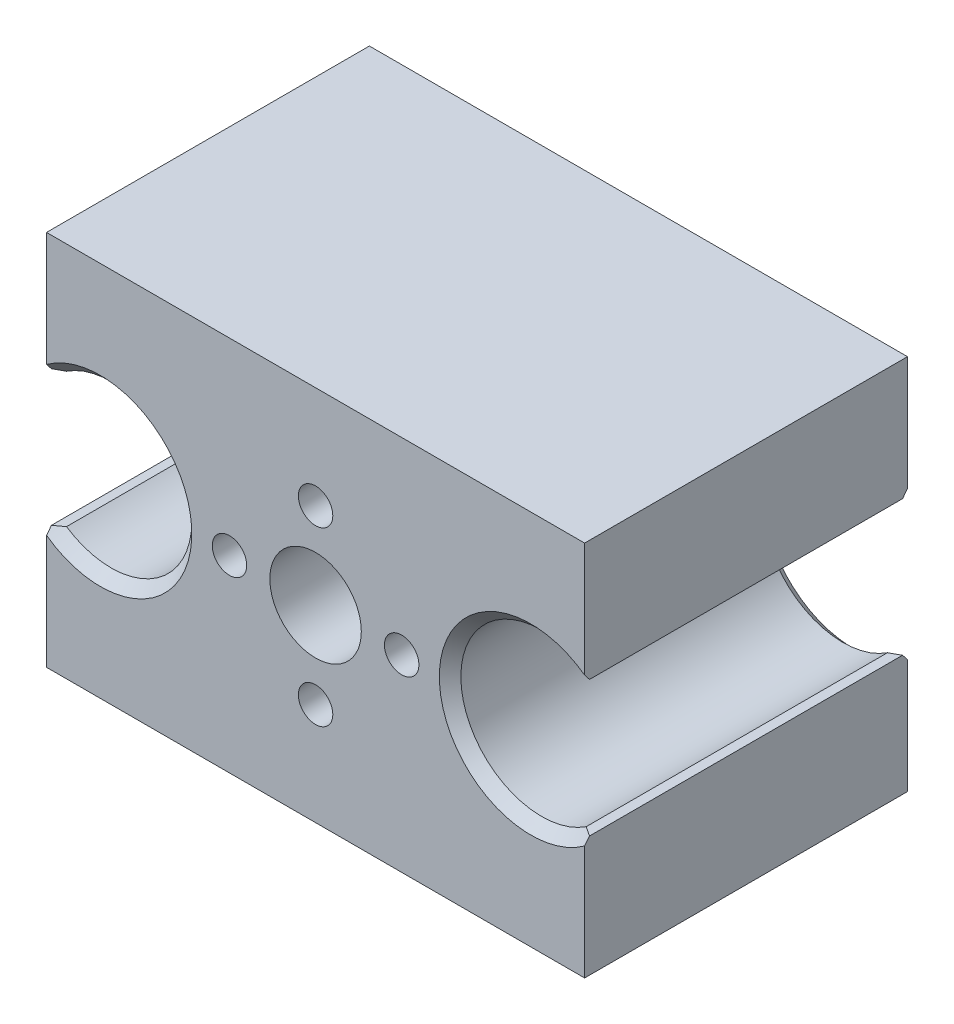
ISO-10303-21;
HEADER;
FILE_DESCRIPTION(('STEP AP214'),'2;1');
FILE_NAME('part.step','',(''),(''),'','','');
FILE_SCHEMA(('AUTOMOTIVE_DESIGN { 1 0 10303 214 1 1 1 1 }'));
ENDSEC;
DATA;
#1=APPLICATION_CONTEXT('core data for automotive mechanical design processes');
#2=APPLICATION_PROTOCOL_DEFINITION('international standard','automotive_design',2000,#1);
#3=PRODUCT_CONTEXT('',#1,'mechanical');
#4=PRODUCT('Part','Part','',(#3));
#5=PRODUCT_RELATED_PRODUCT_CATEGORY('part','',(#4));
#6=PRODUCT_DEFINITION_FORMATION('','',#4);
#7=PRODUCT_DEFINITION_CONTEXT('part definition',#1,'design');
#8=PRODUCT_DEFINITION('design','',#6,#7);
#9=PRODUCT_DEFINITION_SHAPE('','',#8);
#10=(LENGTH_UNIT() NAMED_UNIT(*) SI_UNIT(.MILLI.,.METRE.));
#11=(NAMED_UNIT(*) PLANE_ANGLE_UNIT() SI_UNIT($,.RADIAN.));
#12=(NAMED_UNIT(*) SI_UNIT($,.STERADIAN.) SOLID_ANGLE_UNIT());
#13=UNCERTAINTY_MEASURE_WITH_UNIT(LENGTH_MEASURE(1.E-05),#10,'distance_accuracy_value','');
#14=(GEOMETRIC_REPRESENTATION_CONTEXT(3) GLOBAL_UNCERTAINTY_ASSIGNED_CONTEXT((#13)) GLOBAL_UNIT_ASSIGNED_CONTEXT((#10,
#11,#12)) REPRESENTATION_CONTEXT('',''));
#15=CARTESIAN_POINT('',(0.,0.,0.));
#16=DIRECTION('',(0.,0.,1.));
#17=DIRECTION('',(1.,0.,0.));
#18=AXIS2_PLACEMENT_3D('',#15,#16,#17);
#19=CARTESIAN_POINT('',(25.,-17.5,30.));
#20=DIRECTION('',(-1.,0.,0.));
#21=DIRECTION('',(0.,0.,1.));
#22=AXIS2_PLACEMENT_3D('',#19,#20,#21);
#23=PLANE('',#22);
#24=DIRECTION('',(0.,0.,1.));
#25=VECTOR('',#24,1.);
#26=CARTESIAN_POINT('',(25.,-6.29837387624891,30.));
#27=LINE('',#26,#25);
#28=CARTESIAN_POINT('',(25.,-6.29837387624891,0.458264274112555));
#29=VERTEX_POINT('',#28);
#30=CARTESIAN_POINT('',(25.,-6.29837387624891,29.5417357258874));
#31=VERTEX_POINT('',#30);
#32=EDGE_CURVE('E185',#29,#31,#27,.T.);
#33=ORIENTED_EDGE('',*,*,#32,.T.);
#34=CARTESIAN_POINT('',(25.,-6.29837387624891,29.5417357258874));
#35=CARTESIAN_POINT('',(25.,-6.39488385614054,29.6173659402342));
#36=CARTESIAN_POINT('',(25.,-6.49109633830478,29.6933697531287));
#37=CARTESIAN_POINT('',(25.,-6.6829262265328,29.8461245117944));
#38=CARTESIAN_POINT('',(25.,-6.77854363309685,29.9228754569375));
#39=CARTESIAN_POINT('',(25.,-6.8738635424338,30.));
#40=B_SPLINE_CURVE_WITH_KNOTS('',3,(#34,#35,#36,#37,#38,#39),.UNSPECIFIED.,.F.,.F.,(4,2,4),(0.,
0.367832559309629,0.735664809344251),.UNSPECIFIED.);
#41=CARTESIAN_POINT('',(25.,-6.8738635424338,30.));
#42=VERTEX_POINT('',#41);
#43=EDGE_CURVE('E216',#31,#42,#40,.T.);
#44=ORIENTED_EDGE('',*,*,#43,.T.);
#45=DIRECTION('',(0.,1.,0.));
#46=VECTOR('',#45,1.);
#47=CARTESIAN_POINT('',(25.,-17.5,30.));
#48=LINE('',#47,#46);
#49=CARTESIAN_POINT('',(25.,-17.5,30.));
#50=VERTEX_POINT('',#49);
#51=EDGE_CURVE('E167',#50,#42,#48,.T.);
#52=ORIENTED_EDGE('',*,*,#51,.F.);
#53=DIRECTION('',(0.,0.,-1.));
#54=VECTOR('',#53,1.);
#55=CARTESIAN_POINT('',(25.,-17.5,30.));
#56=LINE('',#55,#54);
#57=CARTESIAN_POINT('',(25.,-17.5,0.));
#58=VERTEX_POINT('',#57);
#59=EDGE_CURVE('E421',#50,#58,#56,.T.);
#60=ORIENTED_EDGE('',*,*,#59,.T.);
#61=DIRECTION('',(0.,1.,0.));
#62=VECTOR('',#61,1.);
#63=CARTESIAN_POINT('',(25.,-17.5,0.));
#64=LINE('',#63,#62);
#65=CARTESIAN_POINT('',(25.,-6.87386354243378,0.));
#66=VERTEX_POINT('',#65);
#67=EDGE_CURVE('E424',#58,#66,#64,.T.);
#68=ORIENTED_EDGE('',*,*,#67,.T.);
#69=CARTESIAN_POINT('',(25.,-6.87386354243378,0.));
#70=CARTESIAN_POINT('',(25.,-6.77854363309684,0.0771245430624894));
#71=CARTESIAN_POINT('',(25.,-6.68292622653279,0.153875488205571));
#72=CARTESIAN_POINT('',(25.,-6.49109633830477,0.306630246871336));
#73=CARTESIAN_POINT('',(25.,-6.39488385614054,0.382634059765773));
#74=CARTESIAN_POINT('',(25.,-6.29837387624891,0.458264274112556));
#75=B_SPLINE_CURVE_WITH_KNOTS('',3,(#69,#70,#71,#72,#73,#74),.UNSPECIFIED.,.F.,.F.,(4,2,4),(0.,
0.367832250034613,0.735664809344231),.UNSPECIFIED.);
#76=EDGE_CURVE('E183',#66,#29,#75,.T.);
#77=ORIENTED_EDGE('',*,*,#76,.T.);
#78=EDGE_LOOP('',(#33,#44,#52,#60,#68,#77));
#79=FACE_BOUND('',#78,.T.);
#80=ADVANCED_FACE('F40',(#79),#23,.F.);
#81=CARTESIAN_POINT('',(0.,0.,30.));
#82=DIRECTION('',(0.,0.,-1.));
#83=DIRECTION('',(-1.,0.,0.));
#84=AXIS2_PLACEMENT_3D('',#81,#82,#83);
#85=PLANE('',#84);
#86=CARTESIAN_POINT('',(0.,0.,30.));
#87=DIRECTION('',(0.,0.,1.));
#88=DIRECTION('',(1.,0.,0.));
#89=AXIS2_PLACEMENT_3D('',#86,#87,#88);
#90=CIRCLE('',#89,4.25000000000001);
#91=CARTESIAN_POINT('',(4.25000000000001,0.,30.));
#92=VERTEX_POINT('',#91);
#93=EDGE_CURVE('E444',#92,#92,#90,.T.);
#94=ORIENTED_EDGE('',*,*,#93,.F.);
#95=EDGE_LOOP('',(#94));
#96=FACE_BOUND('',#95,.T.);
#97=CARTESIAN_POINT('',(0.,-8.,30.));
#98=DIRECTION('',(0.,0.,1.));
#99=DIRECTION('',(1.,0.,0.));
#100=AXIS2_PLACEMENT_3D('',#97,#98,#99);
#101=CIRCLE('',#100,1.60000000000001);
#102=CARTESIAN_POINT('',(1.60000000000001,-8.,30.));
#103=VERTEX_POINT('',#102);
#104=EDGE_CURVE('E454',#103,#103,#101,.T.);
#105=ORIENTED_EDGE('',*,*,#104,.F.);
#106=EDGE_LOOP('',(#105));
#107=FACE_BOUND('',#106,.T.);
#108=CARTESIAN_POINT('',(-8.,0.,30.));
#109=DIRECTION('',(0.,0.,1.));
#110=DIRECTION('',(1.,0.,0.));
#111=AXIS2_PLACEMENT_3D('',#108,#109,#110);
#112=CIRCLE('',#111,1.60000000000001);
#113=CARTESIAN_POINT('',(-6.39999999999999,0.,30.));
#114=VERTEX_POINT('',#113);
#115=EDGE_CURVE('E460',#114,#114,#112,.T.);
#116=ORIENTED_EDGE('',*,*,#115,.F.);
#117=EDGE_LOOP('',(#116));
#118=FACE_BOUND('',#117,.T.);
#119=CARTESIAN_POINT('',(0.,8.,30.));
#120=DIRECTION('',(0.,0.,1.));
#121=DIRECTION('',(1.,0.,0.));
#122=AXIS2_PLACEMENT_3D('',#119,#120,#121);
#123=CIRCLE('',#122,1.60000000000001);
#124=CARTESIAN_POINT('',(1.60000000000001,8.,30.));
#125=VERTEX_POINT('',#124);
#126=EDGE_CURVE('E466',#125,#125,#123,.T.);
#127=ORIENTED_EDGE('',*,*,#126,.F.);
#128=EDGE_LOOP('',(#127));
#129=FACE_BOUND('',#128,.T.);
#130=CARTESIAN_POINT('',(8.,0.,30.));
#131=DIRECTION('',(0.,0.,1.));
#132=DIRECTION('',(1.,0.,0.));
#133=AXIS2_PLACEMENT_3D('',#130,#131,#132);
#134=CIRCLE('',#133,1.60000000000001);
#135=CARTESIAN_POINT('',(9.60000000000002,0.,30.));
#136=VERTEX_POINT('',#135);
#137=EDGE_CURVE('E440',#136,#136,#134,.T.);
#138=ORIENTED_EDGE('',*,*,#137,.F.);
#139=EDGE_LOOP('',(#138));
#140=FACE_BOUND('',#139,.T.);
#141=ORIENTED_EDGE('',*,*,#51,.T.);
#142=CARTESIAN_POINT('',(20.,0.,30.));
#143=DIRECTION('',(0.,0.,-1.));
#144=DIRECTION('',(-1.,0.,0.));
#145=AXIS2_PLACEMENT_3D('',#142,#143,#144);
#146=CIRCLE('',#145,8.50000000000003);
#147=CARTESIAN_POINT('',(25.,6.8738635424338,30.));
#148=VERTEX_POINT('',#147);
#149=EDGE_CURVE('E163',#42,#148,#146,.T.);
#150=ORIENTED_EDGE('',*,*,#149,.T.);
#151=CARTESIAN_POINT('',(25.,17.5,30.));
#152=VERTEX_POINT('',#151);
#153=EDGE_CURVE('E155',#148,#152,#48,.T.);
#154=ORIENTED_EDGE('',*,*,#153,.T.);
#155=DIRECTION('',(-1.,0.,0.));
#156=VECTOR('',#155,1.);
#157=CARTESIAN_POINT('',(-25.,17.5,30.));
#158=LINE('',#157,#156);
#159=CARTESIAN_POINT('',(-25.,17.5,30.));
#160=VERTEX_POINT('',#159);
#161=EDGE_CURVE('E160',#152,#160,#158,.T.);
#162=ORIENTED_EDGE('',*,*,#161,.T.);
#163=DIRECTION('',(0.,-1.,0.));
#164=VECTOR('',#163,1.);
#165=CARTESIAN_POINT('',(-25.,-17.5,30.));
#166=LINE('',#165,#164);
#167=CARTESIAN_POINT('',(-25.,6.8738635424338,30.));
#168=VERTEX_POINT('',#167);
#169=EDGE_CURVE('E398',#160,#168,#166,.T.);
#170=ORIENTED_EDGE('',*,*,#169,.T.);
#171=CARTESIAN_POINT('',(-20.,0.,30.));
#172=DIRECTION('',(0.,0.,-1.));
#173=DIRECTION('',(-1.,0.,0.));
#174=AXIS2_PLACEMENT_3D('',#171,#172,#173);
#175=CIRCLE('',#174,8.50000000000003);
#176=CARTESIAN_POINT('',(-25.,-6.8738635424338,30.));
#177=VERTEX_POINT('',#176);
#178=EDGE_CURVE('E394',#168,#177,#175,.T.);
#179=ORIENTED_EDGE('',*,*,#178,.T.);
#180=CARTESIAN_POINT('',(-25.,-17.5,30.));
#181=VERTEX_POINT('',#180);
#182=EDGE_CURVE('E177',#177,#181,#166,.T.);
#183=ORIENTED_EDGE('',*,*,#182,.T.);
#184=DIRECTION('',(1.,0.,0.));
#185=VECTOR('',#184,1.);
#186=CARTESIAN_POINT('',(-25.,-17.5,30.));
#187=LINE('',#186,#185);
#188=EDGE_CURVE('E420',#181,#50,#187,.T.);
#189=ORIENTED_EDGE('',*,*,#188,.T.);
#190=EDGE_LOOP('',(#141,#150,#154,#162,#170,#179,#183,#189));
#191=FACE_BOUND('',#190,.T.);
#192=ADVANCED_FACE('F158',(#96,#107,#118,#129,#140,#191),#85,.F.);
#193=CARTESIAN_POINT('',(0.,0.,0.));
#194=DIRECTION('',(0.,0.,-1.));
#195=DIRECTION('',(-1.,0.,0.));
#196=AXIS2_PLACEMENT_3D('',#193,#194,#195);
#197=PLANE('',#196);
#198=CARTESIAN_POINT('',(8.,0.,0.));
#199=DIRECTION('',(0.,0.,1.));
#200=DIRECTION('',(1.,0.,0.));
#201=AXIS2_PLACEMENT_3D('',#198,#199,#200);
#202=CIRCLE('',#201,1.60000000000001);
#203=CARTESIAN_POINT('',(9.60000000000001,0.,0.));
#204=VERTEX_POINT('',#203);
#205=EDGE_CURVE('E469',#204,#204,#202,.T.);
#206=ORIENTED_EDGE('',*,*,#205,.T.);
#207=EDGE_LOOP('',(#206));
#208=FACE_BOUND('',#207,.T.);
#209=CARTESIAN_POINT('',(0.,8.,0.));
#210=DIRECTION('',(0.,0.,1.));
#211=DIRECTION('',(1.,0.,0.));
#212=AXIS2_PLACEMENT_3D('',#209,#210,#211);
#213=CIRCLE('',#212,1.60000000000001);
#214=CARTESIAN_POINT('',(1.60000000000001,8.,0.));
#215=VERTEX_POINT('',#214);
#216=EDGE_CURVE('E463',#215,#215,#213,.T.);
#217=ORIENTED_EDGE('',*,*,#216,.T.);
#218=EDGE_LOOP('',(#217));
#219=FACE_BOUND('',#218,.T.);
#220=CARTESIAN_POINT('',(-8.,0.,0.));
#221=DIRECTION('',(0.,0.,1.));
#222=DIRECTION('',(1.,0.,0.));
#223=AXIS2_PLACEMENT_3D('',#220,#221,#222);
#224=CIRCLE('',#223,1.60000000000001);
#225=CARTESIAN_POINT('',(-6.39999999999999,0.,0.));
#226=VERTEX_POINT('',#225);
#227=EDGE_CURVE('E457',#226,#226,#224,.T.);
#228=ORIENTED_EDGE('',*,*,#227,.T.);
#229=EDGE_LOOP('',(#228));
#230=FACE_BOUND('',#229,.T.);
#231=CARTESIAN_POINT('',(0.,-8.,0.));
#232=DIRECTION('',(0.,0.,1.));
#233=DIRECTION('',(1.,0.,0.));
#234=AXIS2_PLACEMENT_3D('',#231,#232,#233);
#235=CIRCLE('',#234,1.60000000000001);
#236=CARTESIAN_POINT('',(1.60000000000001,-8.,0.));
#237=VERTEX_POINT('',#236);
#238=EDGE_CURVE('E449',#237,#237,#235,.T.);
#239=ORIENTED_EDGE('',*,*,#238,.T.);
#240=EDGE_LOOP('',(#239));
#241=FACE_BOUND('',#240,.T.);
#242=CARTESIAN_POINT('',(0.,0.,0.));
#243=DIRECTION('',(0.,0.,1.));
#244=DIRECTION('',(1.,0.,0.));
#245=AXIS2_PLACEMENT_3D('',#242,#243,#244);
#246=CIRCLE('',#245,4.25000000000001);
#247=CARTESIAN_POINT('',(4.25000000000001,0.,0.));
#248=VERTEX_POINT('',#247);
#249=EDGE_CURVE('E442',#248,#248,#246,.T.);
#250=ORIENTED_EDGE('',*,*,#249,.T.);
#251=EDGE_LOOP('',(#250));
#252=FACE_BOUND('',#251,.T.);
#253=CARTESIAN_POINT('',(25.,6.87386354243378,0.));
#254=VERTEX_POINT('',#253);
#255=CARTESIAN_POINT('',(25.,17.5,0.));
#256=VERTEX_POINT('',#255);
#257=EDGE_CURVE('E181',#254,#256,#64,.T.);
#258=ORIENTED_EDGE('',*,*,#257,.F.);
#259=CARTESIAN_POINT('',(20.,0.,0.));
#260=DIRECTION('',(0.,0.,-1.));
#261=DIRECTION('',(-1.,0.,0.));
#262=AXIS2_PLACEMENT_3D('',#259,#260,#261);
#263=CIRCLE('',#262,8.50000000000002);
#264=EDGE_CURVE('E241',#254,#66,#263,.F.);
#265=ORIENTED_EDGE('',*,*,#264,.T.);
#266=ORIENTED_EDGE('',*,*,#67,.F.);
#267=DIRECTION('',(1.,0.,0.));
#268=VECTOR('',#267,1.);
#269=CARTESIAN_POINT('',(-25.,-17.5,0.));
#270=LINE('',#269,#268);
#271=CARTESIAN_POINT('',(-25.,-17.5,0.));
#272=VERTEX_POINT('',#271);
#273=EDGE_CURVE('E168',#272,#58,#270,.T.);
#274=ORIENTED_EDGE('',*,*,#273,.F.);
#275=DIRECTION('',(0.,-1.,0.));
#276=VECTOR('',#275,1.);
#277=CARTESIAN_POINT('',(-25.,-17.5,0.));
#278=LINE('',#277,#276);
#279=CARTESIAN_POINT('',(-25.,-6.87386354243378,0.));
#280=VERTEX_POINT('',#279);
#281=EDGE_CURVE('E407',#280,#272,#278,.T.);
#282=ORIENTED_EDGE('',*,*,#281,.F.);
#283=CARTESIAN_POINT('',(-20.,0.,0.));
#284=DIRECTION('',(0.,0.,-1.));
#285=DIRECTION('',(-1.,0.,0.));
#286=AXIS2_PLACEMENT_3D('',#283,#284,#285);
#287=CIRCLE('',#286,8.50000000000002);
#288=CARTESIAN_POINT('',(-25.,6.87386354243378,0.));
#289=VERTEX_POINT('',#288);
#290=EDGE_CURVE('E238',#280,#289,#287,.F.);
#291=ORIENTED_EDGE('',*,*,#290,.T.);
#292=CARTESIAN_POINT('',(-25.,17.5,0.));
#293=VERTEX_POINT('',#292);
#294=EDGE_CURVE('E413',#293,#289,#278,.T.);
#295=ORIENTED_EDGE('',*,*,#294,.F.);
#296=DIRECTION('',(-1.,0.,0.));
#297=VECTOR('',#296,1.);
#298=CARTESIAN_POINT('',(-25.,17.5,0.));
#299=LINE('',#298,#297);
#300=EDGE_CURVE('E414',#256,#293,#299,.T.);
#301=ORIENTED_EDGE('',*,*,#300,.F.);
#302=EDGE_LOOP('',(#258,#265,#266,#274,#282,#291,#295,#301));
#303=FACE_BOUND('',#302,.T.);
#304=ADVANCED_FACE('F377',(#208,#219,#230,#241,#252,#303),#197,.T.);
#305=CARTESIAN_POINT('',(-25.,-17.5,30.));
#306=DIRECTION('',(1.,0.,0.));
#307=DIRECTION('',(0.,0.,-1.));
#308=AXIS2_PLACEMENT_3D('',#305,#306,#307);
#309=PLANE('',#308);
#310=ORIENTED_EDGE('',*,*,#294,.T.);
#311=CARTESIAN_POINT('',(-25.,6.87386354243378,0.));
#312=CARTESIAN_POINT('',(-25.,6.77854363309684,0.0771245430624881));
#313=CARTESIAN_POINT('',(-25.,6.68292622653279,0.153875488205569));
#314=CARTESIAN_POINT('',(-25.,6.49109633830477,0.306630246871331));
#315=CARTESIAN_POINT('',(-25.,6.39488385614054,0.382634059765766));
#316=CARTESIAN_POINT('',(-25.,6.29837387624891,0.458264274112548));
#317=B_SPLINE_CURVE_WITH_KNOTS('',3,(#311,#312,#313,#314,#315,#316),.UNSPECIFIED.,.F.,.F.,(4,2,
4),(0.,0.36783225003461,0.735664809344226),.UNSPECIFIED.);
#318=CARTESIAN_POINT('',(-25.,6.29837387624891,0.458264274112549));
#319=VERTEX_POINT('',#318);
#320=EDGE_CURVE('E11',#289,#319,#317,.T.);
#321=ORIENTED_EDGE('',*,*,#320,.T.);
#322=DIRECTION('',(0.,0.,1.));
#323=VECTOR('',#322,1.);
#324=CARTESIAN_POINT('',(-25.,6.29837387624891,30.));
#325=LINE('',#324,#323);
#326=CARTESIAN_POINT('',(-25.,6.29837387624891,29.5417357258874));
#327=VERTEX_POINT('',#326);
#328=EDGE_CURVE('E55',#319,#327,#325,.T.);
#329=ORIENTED_EDGE('',*,*,#328,.T.);
#330=CARTESIAN_POINT('',(-25.,6.29837387624891,29.5417357258874));
#331=CARTESIAN_POINT('',(-25.,6.39488385614054,29.6173659402342));
#332=CARTESIAN_POINT('',(-25.,6.49109633830478,29.6933697531287));
#333=CARTESIAN_POINT('',(-25.,6.6829262265328,29.8461245117944));
#334=CARTESIAN_POINT('',(-25.,6.77854363309685,29.9228754569375));
#335=CARTESIAN_POINT('',(-25.,6.8738635424338,30.));
#336=B_SPLINE_CURVE_WITH_KNOTS('',3,(#330,#331,#332,#333,#334,#335),.UNSPECIFIED.,.F.,.F.,(4,2,
4),(0.,0.367832559309628,0.735664809344249),.UNSPECIFIED.);
#337=EDGE_CURVE('E277',#327,#168,#336,.T.);
#338=ORIENTED_EDGE('',*,*,#337,.T.);
#339=ORIENTED_EDGE('',*,*,#169,.F.);
#340=DIRECTION('',(0.,0.,-1.));
#341=VECTOR('',#340,1.);
#342=CARTESIAN_POINT('',(-25.,17.5,30.));
#343=LINE('',#342,#341);
#344=EDGE_CURVE('E175',#160,#293,#343,.T.);
#345=ORIENTED_EDGE('',*,*,#344,.T.);
#346=EDGE_LOOP('',(#310,#321,#329,#338,#339,#345));
#347=FACE_BOUND('',#346,.T.);
#348=ADVANCED_FACE('F207',(#347),#309,.F.);
#349=ORIENTED_EDGE('',*,*,#153,.F.);
#350=CARTESIAN_POINT('',(25.,6.8738635424338,30.));
#351=CARTESIAN_POINT('',(25.,6.77854363309685,29.9228754569375));
#352=CARTESIAN_POINT('',(25.,6.6829262265328,29.8461245117944));
#353=CARTESIAN_POINT('',(25.,6.49109633830478,29.6933697531287));
#354=CARTESIAN_POINT('',(25.,6.39488385614054,29.6173659402342));
#355=CARTESIAN_POINT('',(25.,6.29837387624891,29.5417357258874));
#356=B_SPLINE_CURVE_WITH_KNOTS('',3,(#350,#351,#352,#353,#354,#355),.UNSPECIFIED.,.F.,.F.,(4,2,
4),(0.,0.367832250034623,0.73566480934425),.UNSPECIFIED.);
#357=CARTESIAN_POINT('',(25.,6.29837387624891,29.5417357258874));
#358=VERTEX_POINT('',#357);
#359=EDGE_CURVE('E232',#148,#358,#356,.T.);
#360=ORIENTED_EDGE('',*,*,#359,.T.);
#361=DIRECTION('',(0.,0.,-1.));
#362=VECTOR('',#361,1.);
#363=CARTESIAN_POINT('',(25.,6.29837387624891,30.));
#364=LINE('',#363,#362);
#365=CARTESIAN_POINT('',(25.,6.29837387624891,0.458264274112555));
#366=VERTEX_POINT('',#365);
#367=EDGE_CURVE('E230',#358,#366,#364,.T.);
#368=ORIENTED_EDGE('',*,*,#367,.T.);
#369=CARTESIAN_POINT('',(25.,6.29837387624891,0.458264274112555));
#370=CARTESIAN_POINT('',(25.,6.39488385614054,0.382634059765772));
#371=CARTESIAN_POINT('',(25.,6.49109633830477,0.306630246871336));
#372=CARTESIAN_POINT('',(25.,6.68292622653279,0.153875488205572));
#373=CARTESIAN_POINT('',(25.,6.77854363309684,0.0771245430624909));
#374=CARTESIAN_POINT('',(25.,6.87386354243378,0.));
#375=B_SPLINE_CURVE_WITH_KNOTS('',3,(#369,#370,#371,#372,#373,#374),.UNSPECIFIED.,.F.,.F.,(4,2,
4),(0.,0.367832559309616,0.735664809344228),.UNSPECIFIED.);
#376=EDGE_CURVE('E223',#366,#254,#375,.T.);
#377=ORIENTED_EDGE('',*,*,#376,.T.);
#378=ORIENTED_EDGE('',*,*,#257,.T.);
#379=DIRECTION('',(0.,0.,-1.));
#380=VECTOR('',#379,1.);
#381=CARTESIAN_POINT('',(25.,17.5,30.));
#382=LINE('',#381,#380);
#383=EDGE_CURVE('E173',#152,#256,#382,.T.);
#384=ORIENTED_EDGE('',*,*,#383,.F.);
#385=EDGE_LOOP('',(#349,#360,#368,#377,#378,#384));
#386=FACE_BOUND('',#385,.T.);
#387=ADVANCED_FACE('F179',(#386),#23,.F.);
#388=CARTESIAN_POINT('',(-25.,17.5,30.));
#389=DIRECTION('',(0.,-1.,0.));
#390=DIRECTION('',(0.,0.,-1.));
#391=AXIS2_PLACEMENT_3D('',#388,#389,#390);
#392=PLANE('',#391);
#393=ORIENTED_EDGE('',*,*,#300,.T.);
#394=ORIENTED_EDGE('',*,*,#344,.F.);
#395=ORIENTED_EDGE('',*,*,#161,.F.);
#396=ORIENTED_EDGE('',*,*,#383,.T.);
#397=EDGE_LOOP('',(#393,#394,#395,#396));
#398=FACE_BOUND('',#397,.T.);
#399=ADVANCED_FACE('F172',(#398),#392,.F.);
#400=DIRECTION('',(0.,0.,-1.));
#401=VECTOR('',#400,1.);
#402=CARTESIAN_POINT('',(-25.,-6.29837387624891,30.));
#403=LINE('',#402,#401);
#404=CARTESIAN_POINT('',(-25.,-6.29837387624891,29.5417357258874));
#405=VERTEX_POINT('',#404);
#406=CARTESIAN_POINT('',(-25.,-6.29837387624891,0.458264274112549));
#407=VERTEX_POINT('',#406);
#408=EDGE_CURVE('E258',#405,#407,#403,.T.);
#409=ORIENTED_EDGE('',*,*,#408,.T.);
#410=CARTESIAN_POINT('',(-25.,-6.29837387624891,0.458264274112549));
#411=CARTESIAN_POINT('',(-25.,-6.39488385614054,0.382634059765766));
#412=CARTESIAN_POINT('',(-25.,-6.49109633830477,0.30663024687133));
#413=CARTESIAN_POINT('',(-25.,-6.68292622653279,0.153875488205569));
#414=CARTESIAN_POINT('',(-25.,-6.77854363309684,0.0771245430624885));
#415=CARTESIAN_POINT('',(-25.,-6.87386354243378,0.));
#416=B_SPLINE_CURVE_WITH_KNOTS('',3,(#410,#411,#412,#413,#414,#415),.UNSPECIFIED.,.F.,.F.,(4,2,
4),(0.,0.367832559309616,0.735664809344226),.UNSPECIFIED.);
#417=EDGE_CURVE('E270',#407,#280,#416,.T.);
#418=ORIENTED_EDGE('',*,*,#417,.T.);
#419=ORIENTED_EDGE('',*,*,#281,.T.);
#420=DIRECTION('',(0.,0.,-1.));
#421=VECTOR('',#420,1.);
#422=CARTESIAN_POINT('',(-25.,-17.5,30.));
#423=LINE('',#422,#421);
#424=EDGE_CURVE('E187',#181,#272,#423,.T.);
#425=ORIENTED_EDGE('',*,*,#424,.F.);
#426=ORIENTED_EDGE('',*,*,#182,.F.);
#427=CARTESIAN_POINT('',(-25.,-6.8738635424338,30.));
#428=CARTESIAN_POINT('',(-25.,-6.77854363309685,29.9228754569375));
#429=CARTESIAN_POINT('',(-25.,-6.6829262265328,29.8461245117944));
#430=CARTESIAN_POINT('',(-25.,-6.49109633830478,29.6933697531287));
#431=CARTESIAN_POINT('',(-25.,-6.39488385614054,29.6173659402342));
#432=CARTESIAN_POINT('',(-25.,-6.29837387624891,29.5417357258874));
#433=B_SPLINE_CURVE_WITH_KNOTS('',3,(#427,#428,#429,#430,#431,#432),.UNSPECIFIED.,.F.,.F.,(4,2,
4),(0.,0.367832250034623,0.73566480934425),.UNSPECIFIED.);
#434=EDGE_CURVE('E252',#177,#405,#433,.T.);
#435=ORIENTED_EDGE('',*,*,#434,.T.);
#436=EDGE_LOOP('',(#409,#418,#419,#425,#426,#435));
#437=FACE_BOUND('',#436,.T.);
#438=ADVANCED_FACE('F260',(#437),#309,.F.);
#439=CARTESIAN_POINT('',(-25.,-17.5,30.));
#440=DIRECTION('',(0.,1.,0.));
#441=DIRECTION('',(0.,0.,1.));
#442=AXIS2_PLACEMENT_3D('',#439,#440,#441);
#443=PLANE('',#442);
#444=ORIENTED_EDGE('',*,*,#273,.T.);
#445=ORIENTED_EDGE('',*,*,#59,.F.);
#446=ORIENTED_EDGE('',*,*,#188,.F.);
#447=ORIENTED_EDGE('',*,*,#424,.T.);
#448=EDGE_LOOP('',(#444,#445,#446,#447));
#449=FACE_BOUND('',#448,.T.);
#450=ADVANCED_FACE('F264',(#449),#443,.F.);
#451=CARTESIAN_POINT('',(0.,0.,30.));
#452=DIRECTION('',(0.,0.,1.));
#453=DIRECTION('',(1.,0.,0.));
#454=AXIS2_PLACEMENT_3D('',#451,#452,#453);
#455=CYLINDRICAL_SURFACE('',#454,4.25000000000001);
#456=ORIENTED_EDGE('',*,*,#249,.F.);
#457=EDGE_LOOP('',(#456));
#458=FACE_BOUND('',#457,.T.);
#459=ORIENTED_EDGE('',*,*,#93,.T.);
#460=EDGE_LOOP('',(#459));
#461=FACE_BOUND('',#460,.T.);
#462=ADVANCED_FACE('F499',(#458,#461),#455,.F.);
#463=CARTESIAN_POINT('',(0.,-8.,30.));
#464=DIRECTION('',(0.,0.,1.));
#465=DIRECTION('',(1.,0.,0.));
#466=AXIS2_PLACEMENT_3D('',#463,#464,#465);
#467=CYLINDRICAL_SURFACE('',#466,1.60000000000001);
#468=ORIENTED_EDGE('',*,*,#238,.F.);
#469=EDGE_LOOP('',(#468));
#470=FACE_BOUND('',#469,.T.);
#471=ORIENTED_EDGE('',*,*,#104,.T.);
#472=EDGE_LOOP('',(#471));
#473=FACE_BOUND('',#472,.T.);
#474=ADVANCED_FACE('F495',(#470,#473),#467,.F.);
#475=CARTESIAN_POINT('',(-8.,0.,30.));
#476=DIRECTION('',(0.,0.,1.));
#477=DIRECTION('',(1.,0.,0.));
#478=AXIS2_PLACEMENT_3D('',#475,#476,#477);
#479=CYLINDRICAL_SURFACE('',#478,1.60000000000001);
#480=ORIENTED_EDGE('',*,*,#227,.F.);
#481=EDGE_LOOP('',(#480));
#482=FACE_BOUND('',#481,.T.);
#483=ORIENTED_EDGE('',*,*,#115,.T.);
#484=EDGE_LOOP('',(#483));
#485=FACE_BOUND('',#484,.T.);
#486=ADVANCED_FACE('F487',(#482,#485),#479,.F.);
#487=CARTESIAN_POINT('',(0.,8.,30.));
#488=DIRECTION('',(0.,0.,1.));
#489=DIRECTION('',(1.,0.,0.));
#490=AXIS2_PLACEMENT_3D('',#487,#488,#489);
#491=CYLINDRICAL_SURFACE('',#490,1.60000000000001);
#492=ORIENTED_EDGE('',*,*,#216,.F.);
#493=EDGE_LOOP('',(#492));
#494=FACE_BOUND('',#493,.T.);
#495=ORIENTED_EDGE('',*,*,#126,.T.);
#496=EDGE_LOOP('',(#495));
#497=FACE_BOUND('',#496,.T.);
#498=ADVANCED_FACE('F478',(#494,#497),#491,.F.);
#499=CARTESIAN_POINT('',(8.,0.,30.));
#500=DIRECTION('',(0.,0.,1.));
#501=DIRECTION('',(1.,0.,0.));
#502=AXIS2_PLACEMENT_3D('',#499,#500,#501);
#503=CYLINDRICAL_SURFACE('',#502,1.60000000000001);
#504=ORIENTED_EDGE('',*,*,#205,.F.);
#505=EDGE_LOOP('',(#504));
#506=FACE_BOUND('',#505,.T.);
#507=ORIENTED_EDGE('',*,*,#137,.T.);
#508=EDGE_LOOP('',(#507));
#509=FACE_BOUND('',#508,.T.);
#510=ADVANCED_FACE('F475',(#506,#509),#503,.F.);
#511=CARTESIAN_POINT('',(-20.,0.,30.));
#512=DIRECTION('',(0.,0.,1.));
#513=DIRECTION('',(1.,0.,0.));
#514=AXIS2_PLACEMENT_3D('',#511,#512,#513);
#515=CYLINDRICAL_SURFACE('',#514,7.50000000000001);
#516=DIRECTION('',(0.,0.,1.));
#517=VECTOR('',#516,1.);
#518=CARTESIAN_POINT('',(-24.1447101151354,6.25071020456831,30.));
#519=LINE('',#518,#517);
#520=CARTESIAN_POINT('',(-24.1447101151354,6.25071020456831,29.));
#521=VERTEX_POINT('',#520);
#522=CARTESIAN_POINT('',(-24.1447101151354,6.25071020456831,0.999999999999994));
#523=VERTEX_POINT('',#522);
#524=EDGE_CURVE('E247',#521,#523,#519,.F.);
#525=ORIENTED_EDGE('',*,*,#524,.T.);
#526=CARTESIAN_POINT('',(-20.,0.,0.999999999999994));
#527=DIRECTION('',(0.,0.,-1.));
#528=DIRECTION('',(-1.,0.,0.));
#529=AXIS2_PLACEMENT_3D('',#526,#527,#528);
#530=CIRCLE('',#529,7.50000000000001);
#531=CARTESIAN_POINT('',(-24.1447101151354,-6.25071020456831,0.999999999999994));
#532=VERTEX_POINT('',#531);
#533=EDGE_CURVE('E249',#523,#532,#530,.T.);
#534=ORIENTED_EDGE('',*,*,#533,.T.);
#535=DIRECTION('',(0.,0.,1.));
#536=VECTOR('',#535,1.);
#537=CARTESIAN_POINT('',(-24.1447101151354,-6.25071020456831,30.));
#538=LINE('',#537,#536);
#539=CARTESIAN_POINT('',(-24.1447101151354,-6.25071020456831,29.));
#540=VERTEX_POINT('',#539);
#541=EDGE_CURVE('E245',#532,#540,#538,.T.);
#542=ORIENTED_EDGE('',*,*,#541,.T.);
#543=CARTESIAN_POINT('',(-20.,0.,29.));
#544=DIRECTION('',(0.,0.,-1.));
#545=DIRECTION('',(-1.,0.,0.));
#546=AXIS2_PLACEMENT_3D('',#543,#544,#545);
#547=CIRCLE('',#546,7.50000000000001);
#548=EDGE_CURVE('E243',#540,#521,#547,.F.);
#549=ORIENTED_EDGE('',*,*,#548,.T.);
#550=EDGE_LOOP('',(#525,#534,#542,#549));
#551=FACE_BOUND('',#550,.T.);
#552=ADVANCED_FACE('F419',(#551),#515,.F.);
#553=CARTESIAN_POINT('',(20.,0.,30.));
#554=DIRECTION('',(0.,0.,1.));
#555=DIRECTION('',(1.,0.,0.));
#556=AXIS2_PLACEMENT_3D('',#553,#554,#555);
#557=CYLINDRICAL_SURFACE('',#556,7.50000000000001);
#558=CARTESIAN_POINT('',(20.,0.,29.));
#559=DIRECTION('',(0.,0.,-1.));
#560=DIRECTION('',(-1.,0.,0.));
#561=AXIS2_PLACEMENT_3D('',#558,#559,#560);
#562=CIRCLE('',#561,7.50000000000001);
#563=CARTESIAN_POINT('',(24.1447101151354,6.25071020456831,29.));
#564=VERTEX_POINT('',#563);
#565=CARTESIAN_POINT('',(24.1447101151354,-6.25071020456831,29.));
#566=VERTEX_POINT('',#565);
#567=EDGE_CURVE('E389',#564,#566,#562,.F.);
#568=ORIENTED_EDGE('',*,*,#567,.T.);
#569=DIRECTION('',(0.,0.,1.));
#570=VECTOR('',#569,1.);
#571=CARTESIAN_POINT('',(24.1447101151354,-6.25071020456831,30.));
#572=LINE('',#571,#570);
#573=CARTESIAN_POINT('',(24.1447101151354,-6.25071020456831,1.00000000000001));
#574=VERTEX_POINT('',#573);
#575=EDGE_CURVE('E393',#566,#574,#572,.F.);
#576=ORIENTED_EDGE('',*,*,#575,.T.);
#577=CARTESIAN_POINT('',(20.,0.,1.00000000000001));
#578=DIRECTION('',(0.,0.,-1.));
#579=DIRECTION('',(-1.,0.,0.));
#580=AXIS2_PLACEMENT_3D('',#577,#578,#579);
#581=CIRCLE('',#580,7.50000000000001);
#582=CARTESIAN_POINT('',(24.1447101151354,6.25071020456831,1.00000000000001));
#583=VERTEX_POINT('',#582);
#584=EDGE_CURVE('E384',#574,#583,#581,.T.);
#585=ORIENTED_EDGE('',*,*,#584,.T.);
#586=DIRECTION('',(0.,0.,1.));
#587=VECTOR('',#586,1.);
#588=CARTESIAN_POINT('',(24.1447101151354,6.25071020456831,30.));
#589=LINE('',#588,#587);
#590=EDGE_CURVE('E385',#583,#564,#589,.T.);
#591=ORIENTED_EDGE('',*,*,#590,.T.);
#592=EDGE_LOOP('',(#568,#576,#585,#591));
#593=FACE_BOUND('',#592,.T.);
#594=ADVANCED_FACE('F485',(#593),#557,.F.);
#595=CARTESIAN_POINT('',(25.,6.29837387624891,30.));
#596=DIRECTION('',(0.0556417559037672,-0.998450797485758,0.));
#597=DIRECTION('',(0.,0.,1.));
#598=AXIS2_PLACEMENT_3D('',#595,#596,#597);
#599=PLANE('',#598);
#600=CARTESIAN_POINT('',(25.,6.29837387624891,29.5417357258874));
#601=CARTESIAN_POINT('',(24.9297469400284,6.29445880739998,29.4949902781776));
#602=CARTESIAN_POINT('',(24.8592569166312,6.29053053303193,29.4486006938272));
#603=CARTESIAN_POINT('',(24.7177838918034,6.28264651157162,29.3566038804387));
#604=CARTESIAN_POINT('',(24.6468009605939,6.27869076839266,29.3109965430462));
#605=CARTESIAN_POINT('',(24.5043023976615,6.27074959565256,29.2206210843675));
#606=CARTESIAN_POINT('',(24.4327867579904,6.26676416564849,29.1758529756381));
#607=CARTESIAN_POINT('',(24.2891830542685,6.25876140552301,29.0872249653439));
#608=CARTESIAN_POINT('',(24.2170949116467,6.25474407102299,29.0433651915278));
#609=CARTESIAN_POINT('',(24.1447101151354,6.25071020456831,29.));
#610=B_SPLINE_CURVE_WITH_KNOTS('',3,(#600,#601,#602,#603,#604,#605,#606,#607,#608,#609),
.UNSPECIFIED.,.F.,.F.,(4,2,2,2,4),(0.,0.253423790157961,0.506812188638805,0.760204375345846,
1.0136319605022),.UNSPECIFIED.);
#611=EDGE_CURVE('E345',#564,#358,#610,.F.);
#612=ORIENTED_EDGE('',*,*,#611,.F.);
#613=ORIENTED_EDGE('',*,*,#590,.F.);
#614=CARTESIAN_POINT('',(25.,6.29837387624891,0.458264274112557));
#615=CARTESIAN_POINT('',(24.9297469400284,6.29445880739998,0.505009721822358));
#616=CARTESIAN_POINT('',(24.8592569166312,6.29053053303193,0.551399306172786));
#617=CARTESIAN_POINT('',(24.7177838918034,6.28264651157162,0.643396119561309));
#618=CARTESIAN_POINT('',(24.6468009605939,6.27869076839266,0.689003456953799));
#619=CARTESIAN_POINT('',(24.5043023976615,6.27074959565256,0.77937891563245));
#620=CARTESIAN_POINT('',(24.4327867579904,6.26676416564849,0.824147024361905));
#621=CARTESIAN_POINT('',(24.2891830542685,6.25876140552301,0.912775034656092));
#622=CARTESIAN_POINT('',(24.2170949116467,6.25474407102299,0.95663480847218));
#623=CARTESIAN_POINT('',(24.1447101151354,6.25071020456831,1.00000000000001));
#624=B_SPLINE_CURVE_WITH_KNOTS('',3,(#614,#615,#616,#617,#618,#619,#620,#621,#622,#623),
.UNSPECIFIED.,.F.,.F.,(4,2,2,2,4),(0.,0.253423790157962,0.506812188638806,0.760204375345845,
1.0136319605022),.UNSPECIFIED.);
#625=EDGE_CURVE('E349',#366,#583,#624,.T.);
#626=ORIENTED_EDGE('',*,*,#625,.F.);
#627=ORIENTED_EDGE('',*,*,#367,.F.);
#628=EDGE_LOOP('',(#612,#613,#626,#627));
#629=FACE_BOUND('',#628,.T.);
#630=ADVANCED_FACE('F436',(#629),#599,.T.);
#631=CARTESIAN_POINT('',(20.,0.,0.));
#632=DIRECTION('',(0.,0.,-1.));
#633=DIRECTION('',(-1.,0.,0.));
#634=AXIS2_PLACEMENT_3D('',#631,#632,#633);
#635=CONICAL_SURFACE('',#634,8.50000000000002,0.785398163397445);
#636=ORIENTED_EDGE('',*,*,#625,.T.);
#637=ORIENTED_EDGE('',*,*,#584,.F.);
#638=CARTESIAN_POINT('',(24.1447101151354,-6.25071020456831,1.00000000000001));
#639=CARTESIAN_POINT('',(24.2170949116467,-6.25474407102298,0.956634808472176));
#640=CARTESIAN_POINT('',(24.2891830542685,-6.25876140552301,0.91277503465609));
#641=CARTESIAN_POINT('',(24.4327867579904,-6.26676416564849,0.824147024361907));
#642=CARTESIAN_POINT('',(24.5043023976615,-6.27074959565256,0.779378915632455));
#643=CARTESIAN_POINT('',(24.6468009605939,-6.27869076839265,0.689003456953796));
#644=CARTESIAN_POINT('',(24.7177838918034,-6.28264651157162,0.643396119561296));
#645=CARTESIAN_POINT('',(24.8592569166312,-6.29053053303193,0.551399306172803));
#646=CARTESIAN_POINT('',(24.9297469400284,-6.29445880739998,0.505009721822415));
#647=CARTESIAN_POINT('',(25.0000000000001,-6.29837387624892,0.45826427411271));
#648=B_SPLINE_CURVE_WITH_KNOTS('',3,(#638,#639,#640,#641,#642,#643,#644,#645,#646,#647),
.UNSPECIFIED.,.F.,.F.,(4,2,2,2,4),(0.,0.253427585156351,0.50681977186339,0.760208170344233,
1.01363196050218),.UNSPECIFIED.);
#649=EDGE_CURVE('E339',#29,#574,#648,.F.);
#650=ORIENTED_EDGE('',*,*,#649,.F.);
#651=ORIENTED_EDGE('',*,*,#76,.F.);
#652=ORIENTED_EDGE('',*,*,#264,.F.);
#653=ORIENTED_EDGE('',*,*,#376,.F.);
#654=EDGE_LOOP('',(#636,#637,#650,#651,#652,#653));
#655=FACE_BOUND('',#654,.T.);
#656=ADVANCED_FACE('F199',(#655),#635,.F.);
#657=CARTESIAN_POINT('',(20.,0.,29.));
#658=DIRECTION('',(0.,0.,1.));
#659=DIRECTION('',(1.,0.,0.));
#660=AXIS2_PLACEMENT_3D('',#657,#658,#659);
#661=CONICAL_SURFACE('',#660,7.50000000000001,0.78539816339745);
#662=ORIENTED_EDGE('',*,*,#149,.F.);
#663=ORIENTED_EDGE('',*,*,#43,.F.);
#664=CARTESIAN_POINT('',(25.,-6.29837387624891,29.5417357258874));
#665=CARTESIAN_POINT('',(24.9297469400284,-6.29445880739997,29.4949902781776));
#666=CARTESIAN_POINT('',(24.8592569166312,-6.29053053303193,29.4486006938272));
#667=CARTESIAN_POINT('',(24.7177838918034,-6.28264651157162,29.3566038804387));
#668=CARTESIAN_POINT('',(24.6468009605939,-6.27869076839265,29.3109965430462));
#669=CARTESIAN_POINT('',(24.5043023976615,-6.27074959565256,29.2206210843675));
#670=CARTESIAN_POINT('',(24.4327867579904,-6.26676416564849,29.1758529756381));
#671=CARTESIAN_POINT('',(24.2891830542685,-6.25876140552301,29.0872249653439));
#672=CARTESIAN_POINT('',(24.2170949116467,-6.25474407102298,29.0433651915278));
#673=CARTESIAN_POINT('',(24.1447101151354,-6.25071020456831,29.));
#674=B_SPLINE_CURVE_WITH_KNOTS('',3,(#664,#665,#666,#667,#668,#669,#670,#671,#672,#673),
.UNSPECIFIED.,.F.,.F.,(4,2,2,2,4),(0.,0.253423790157958,0.506812188638802,0.76020437534584,
1.01363196050219),.UNSPECIFIED.);
#675=EDGE_CURVE('E288',#566,#31,#674,.F.);
#676=ORIENTED_EDGE('',*,*,#675,.F.);
#677=ORIENTED_EDGE('',*,*,#567,.F.);
#678=ORIENTED_EDGE('',*,*,#611,.T.);
#679=ORIENTED_EDGE('',*,*,#359,.F.);
#680=EDGE_LOOP('',(#662,#663,#676,#677,#678,#679));
#681=FACE_BOUND('',#680,.T.);
#682=ADVANCED_FACE('F210',(#681),#661,.F.);
#683=CARTESIAN_POINT('',(25.,-6.29837387624891,30.));
#684=DIRECTION('',(-0.0556417559037707,-0.998450797485757,0.));
#685=DIRECTION('',(0.,0.,1.));
#686=AXIS2_PLACEMENT_3D('',#683,#684,#685);
#687=PLANE('',#686);
#688=ORIENTED_EDGE('',*,*,#649,.T.);
#689=ORIENTED_EDGE('',*,*,#575,.F.);
#690=ORIENTED_EDGE('',*,*,#675,.T.);
#691=ORIENTED_EDGE('',*,*,#32,.F.);
#692=EDGE_LOOP('',(#688,#689,#690,#691));
#693=FACE_BOUND('',#692,.T.);
#694=ADVANCED_FACE('F360',(#693),#687,.F.);
#695=CARTESIAN_POINT('',(-20.,0.,29.));
#696=DIRECTION('',(0.,0.,1.));
#697=DIRECTION('',(1.,0.,0.));
#698=AXIS2_PLACEMENT_3D('',#695,#696,#697);
#699=CONICAL_SURFACE('',#698,7.50000000000001,0.78539816339745);
#700=ORIENTED_EDGE('',*,*,#178,.F.);
#701=ORIENTED_EDGE('',*,*,#337,.F.);
#702=CARTESIAN_POINT('',(-25.,6.29837387624891,29.5417357258874));
#703=CARTESIAN_POINT('',(-24.9297469400284,6.29445880739998,29.4949902781776));
#704=CARTESIAN_POINT('',(-24.8592569166312,6.29053053303193,29.4486006938272));
#705=CARTESIAN_POINT('',(-24.7177838918034,6.28264651157162,29.3566038804387));
#706=CARTESIAN_POINT('',(-24.6468009605939,6.27869076839266,29.3109965430462));
#707=CARTESIAN_POINT('',(-24.5043023976615,6.27074959565256,29.2206210843675));
#708=CARTESIAN_POINT('',(-24.4327867579904,6.26676416564849,29.1758529756381));
#709=CARTESIAN_POINT('',(-24.2891830542685,6.25876140552301,29.0872249653439));
#710=CARTESIAN_POINT('',(-24.2170949116467,6.25474407102299,29.0433651915278));
#711=CARTESIAN_POINT('',(-24.1447101151354,6.25071020456831,29.));
#712=B_SPLINE_CURVE_WITH_KNOTS('',3,(#702,#703,#704,#705,#706,#707,#708,#709,#710,#711),
.UNSPECIFIED.,.F.,.F.,(4,2,2,2,4),(0.,0.253423790157961,0.506812188638805,0.760204375345846,
1.0136319605022),.UNSPECIFIED.);
#713=EDGE_CURVE('E46',#521,#327,#712,.F.);
#714=ORIENTED_EDGE('',*,*,#713,.F.);
#715=ORIENTED_EDGE('',*,*,#548,.F.);
#716=CARTESIAN_POINT('',(-24.1447101151354,-6.25071020456831,29.));
#717=CARTESIAN_POINT('',(-24.2170949116467,-6.25474407102299,29.0433651915278));
#718=CARTESIAN_POINT('',(-24.2891830542685,-6.25876140552301,29.0872249653439));
#719=CARTESIAN_POINT('',(-24.4327867579904,-6.2667641656485,29.1758529756381));
#720=CARTESIAN_POINT('',(-24.5043023976615,-6.27074959565256,29.2206210843675));
#721=CARTESIAN_POINT('',(-24.6468009605939,-6.27869076839266,29.3109965430462));
#722=CARTESIAN_POINT('',(-24.7177838918034,-6.28264651157162,29.3566038804387));
#723=CARTESIAN_POINT('',(-24.8592569166312,-6.29053053303193,29.4486006938272));
#724=CARTESIAN_POINT('',(-24.9297469400284,-6.29445880739998,29.4949902781776));
#725=CARTESIAN_POINT('',(-25.0000000000001,-6.29837387624892,29.5417357258873));
#726=B_SPLINE_CURVE_WITH_KNOTS('',3,(#716,#717,#718,#719,#720,#721,#722,#723,#724,#725),
.UNSPECIFIED.,.F.,.F.,(4,2,2,2,4),(0.,0.25342758515635,0.506819771863392,0.76020817034423,
1.01363196050219),.UNSPECIFIED.);
#727=EDGE_CURVE('E325',#405,#540,#726,.F.);
#728=ORIENTED_EDGE('',*,*,#727,.F.);
#729=ORIENTED_EDGE('',*,*,#434,.F.);
#730=EDGE_LOOP('',(#700,#701,#714,#715,#728,#729));
#731=FACE_BOUND('',#730,.T.);
#732=ADVANCED_FACE('F43',(#731),#699,.F.);
#733=CARTESIAN_POINT('',(-25.,6.29837387624891,30.));
#734=DIRECTION('',(0.0556417559037672,0.998450797485758,0.));
#735=DIRECTION('',(0.,0.,1.));
#736=AXIS2_PLACEMENT_3D('',#733,#734,#735);
#737=PLANE('',#736);
#738=ORIENTED_EDGE('',*,*,#713,.T.);
#739=ORIENTED_EDGE('',*,*,#328,.F.);
#740=CARTESIAN_POINT('',(-25.,6.29837387624891,0.458264274112549));
#741=CARTESIAN_POINT('',(-24.9297469400284,6.29445880739998,0.505009721822349));
#742=CARTESIAN_POINT('',(-24.8592569166312,6.29053053303193,0.551399306172777));
#743=CARTESIAN_POINT('',(-24.7177838918034,6.28264651157162,0.643396119561298));
#744=CARTESIAN_POINT('',(-24.6468009605939,6.27869076839266,0.689003456953787));
#745=CARTESIAN_POINT('',(-24.5043023976615,6.27074959565256,0.779378915632436));
#746=CARTESIAN_POINT('',(-24.4327867579904,6.26676416564849,0.824147024361891));
#747=CARTESIAN_POINT('',(-24.2891830542685,6.25876140552301,0.912775034656076));
#748=CARTESIAN_POINT('',(-24.2170949116467,6.25474407102299,0.956634808472164));
#749=CARTESIAN_POINT('',(-24.1447101151354,6.25071020456831,0.999999999999994));
#750=B_SPLINE_CURVE_WITH_KNOTS('',3,(#740,#741,#742,#743,#744,#745,#746,#747,#748,#749),
.UNSPECIFIED.,.F.,.F.,(4,2,2,2,4),(0.,0.253423790157961,0.506812188638803,0.760204375345841,
1.01363196050219),.UNSPECIFIED.);
#751=EDGE_CURVE('E319',#523,#319,#750,.F.);
#752=ORIENTED_EDGE('',*,*,#751,.F.);
#753=ORIENTED_EDGE('',*,*,#524,.F.);
#754=EDGE_LOOP('',(#738,#739,#752,#753));
#755=FACE_BOUND('',#754,.T.);
#756=ADVANCED_FACE('F306',(#755),#737,.F.);
#757=CARTESIAN_POINT('',(-25.,-6.29837387624891,30.));
#758=DIRECTION('',(-0.0556417559037672,0.998450797485758,0.));
#759=DIRECTION('',(0.,0.,1.));
#760=AXIS2_PLACEMENT_3D('',#757,#758,#759);
#761=PLANE('',#760);
#762=ORIENTED_EDGE('',*,*,#727,.T.);
#763=ORIENTED_EDGE('',*,*,#541,.F.);
#764=CARTESIAN_POINT('',(-24.1447101151354,-6.25071020456831,0.999999999999994));
#765=CARTESIAN_POINT('',(-24.2170949116467,-6.25474407102299,0.95663480847216));
#766=CARTESIAN_POINT('',(-24.2891830542685,-6.25876140552301,0.912775034656075));
#767=CARTESIAN_POINT('',(-24.4327867579904,-6.2667641656485,0.824147024361894));
#768=CARTESIAN_POINT('',(-24.5043023976615,-6.27074959565256,0.779378915632441));
#769=CARTESIAN_POINT('',(-24.6468009605939,-6.27869076839266,0.689003456953785));
#770=CARTESIAN_POINT('',(-24.7177838918034,-6.28264651157162,0.643396119561286));
#771=CARTESIAN_POINT('',(-24.8592569166312,-6.29053053303193,0.551399306172794));
#772=CARTESIAN_POINT('',(-24.9297469400284,-6.29445880739998,0.505009721822406));
#773=CARTESIAN_POINT('',(-25.0000000000001,-6.29837387624892,0.458264274112701));
#774=B_SPLINE_CURVE_WITH_KNOTS('',3,(#764,#765,#766,#767,#768,#769,#770,#771,#772,#773),
.UNSPECIFIED.,.F.,.F.,(4,2,2,2,4),(0.,0.253427585156349,0.506819771863391,0.760208170344229,
1.01363196050219),.UNSPECIFIED.);
#775=EDGE_CURVE('E311',#407,#532,#774,.F.);
#776=ORIENTED_EDGE('',*,*,#775,.F.);
#777=ORIENTED_EDGE('',*,*,#408,.F.);
#778=EDGE_LOOP('',(#762,#763,#776,#777));
#779=FACE_BOUND('',#778,.T.);
#780=ADVANCED_FACE('F303',(#779),#761,.T.);
#781=CARTESIAN_POINT('',(-20.,0.,0.999999999999994));
#782=DIRECTION('',(0.,0.,-1.));
#783=DIRECTION('',(-1.,0.,0.));
#784=AXIS2_PLACEMENT_3D('',#781,#782,#783);
#785=CONICAL_SURFACE('',#784,7.50000000000001,0.785398163397453);
#786=ORIENTED_EDGE('',*,*,#320,.F.);
#787=ORIENTED_EDGE('',*,*,#290,.F.);
#788=ORIENTED_EDGE('',*,*,#417,.F.);
#789=ORIENTED_EDGE('',*,*,#775,.T.);
#790=ORIENTED_EDGE('',*,*,#533,.F.);
#791=ORIENTED_EDGE('',*,*,#751,.T.);
#792=EDGE_LOOP('',(#786,#787,#788,#789,#790,#791));
#793=FACE_BOUND('',#792,.T.);
#794=ADVANCED_FACE('F295',(#793),#785,.F.);
#795=CLOSED_SHELL('',(#80,#192,#304,#348,#387,#399,#438,#450,#462,#474,#486,#498,#510,#552,#594,
#630,#656,#682,#694,#732,#756,#780,#794));
#796=MANIFOLD_SOLID_BREP('B2',#795);
#797=ADVANCED_BREP_SHAPE_REPRESENTATION('',(#18,#796),#14);
#798=SHAPE_DEFINITION_REPRESENTATION(#9,#797);
ENDSEC;
END-ISO-10303-21;
